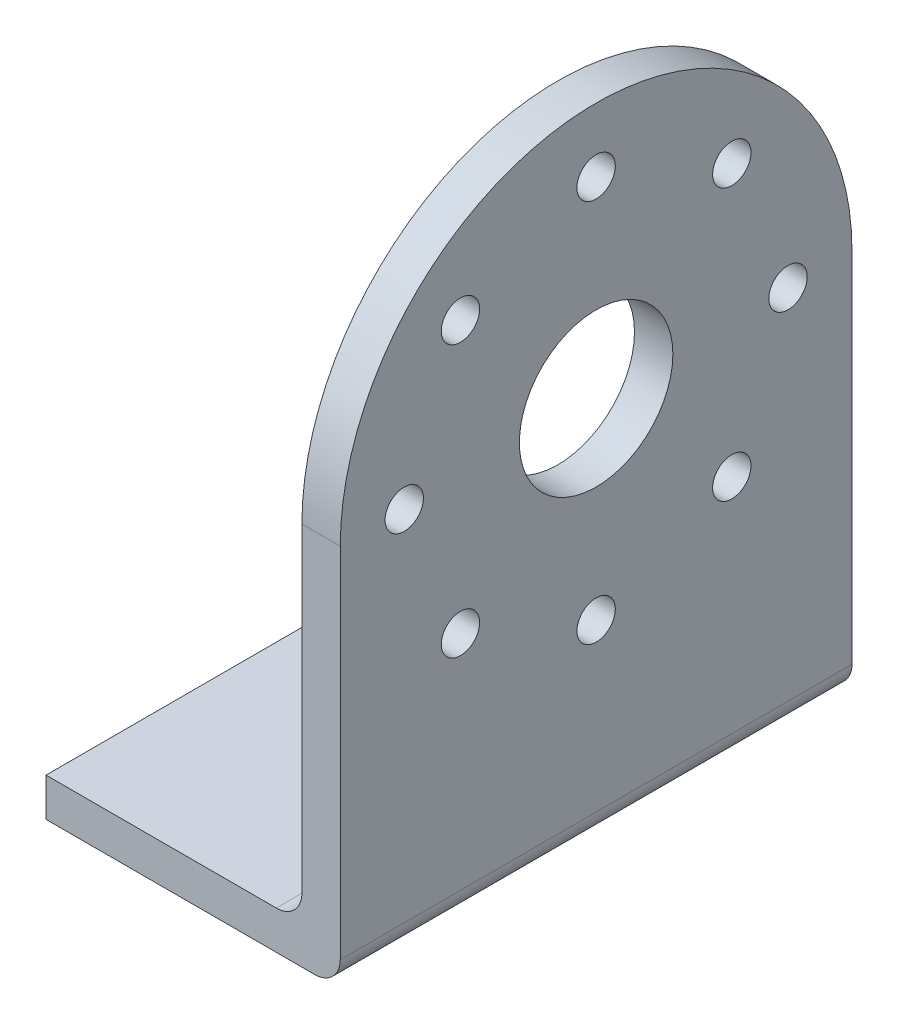
ISO-10303-21;
HEADER;
FILE_DESCRIPTION(('STEP AP214'),'2;1');
FILE_NAME('part.step','',(''),(''),'','','');
FILE_SCHEMA(('AUTOMOTIVE_DESIGN { 1 0 10303 214 1 1 1 1 }'));
ENDSEC;
DATA;
#1=APPLICATION_CONTEXT('core data for automotive mechanical design processes');
#2=APPLICATION_PROTOCOL_DEFINITION('international standard','automotive_design',2000,#1);
#3=PRODUCT_CONTEXT('',#1,'mechanical');
#4=PRODUCT('Part','Part','',(#3));
#5=PRODUCT_RELATED_PRODUCT_CATEGORY('part','',(#4));
#6=PRODUCT_DEFINITION_FORMATION('','',#4);
#7=PRODUCT_DEFINITION_CONTEXT('part definition',#1,'design');
#8=PRODUCT_DEFINITION('design','',#6,#7);
#9=PRODUCT_DEFINITION_SHAPE('','',#8);
#10=(LENGTH_UNIT() NAMED_UNIT(*) SI_UNIT(.MILLI.,.METRE.));
#11=(NAMED_UNIT(*) PLANE_ANGLE_UNIT() SI_UNIT($,.RADIAN.));
#12=(NAMED_UNIT(*) SI_UNIT($,.STERADIAN.) SOLID_ANGLE_UNIT());
#13=UNCERTAINTY_MEASURE_WITH_UNIT(LENGTH_MEASURE(1.E-05),#10,'distance_accuracy_value','');
#14=(GEOMETRIC_REPRESENTATION_CONTEXT(3) GLOBAL_UNCERTAINTY_ASSIGNED_CONTEXT((#13)) GLOBAL_UNIT_ASSIGNED_CONTEXT((#10,
#11,#12)) REPRESENTATION_CONTEXT('',''));
#15=CARTESIAN_POINT('',(0.,0.,0.));
#16=DIRECTION('',(0.,0.,1.));
#17=DIRECTION('',(1.,0.,0.));
#18=AXIS2_PLACEMENT_3D('',#15,#16,#17);
#19=CARTESIAN_POINT('',(0.,0.,0.));
#20=DIRECTION('',(1.,0.,0.));
#21=DIRECTION('',(0.,0.,-1.));
#22=AXIS2_PLACEMENT_3D('',#19,#20,#21);
#23=PLANE('',#22);
#24=CARTESIAN_POINT('',(0.,0.,0.));
#25=DIRECTION('',(1.,0.,0.));
#26=DIRECTION('',(0.,0.,-1.));
#27=AXIS2_PLACEMENT_3D('',#24,#25,#26);
#28=CIRCLE('',#27,6.);
#29=CARTESIAN_POINT('',(0.,0.,-6.));
#30=VERTEX_POINT('',#29);
#31=EDGE_CURVE('E194',#30,#30,#28,.T.);
#32=ORIENTED_EDGE('',*,*,#31,.T.);
#33=EDGE_LOOP('',(#32));
#34=FACE_BOUND('',#33,.T.);
#35=CARTESIAN_POINT('',(0.,15.,0.));
#36=DIRECTION('',(1.,0.,0.));
#37=DIRECTION('',(0.,0.,-1.));
#38=AXIS2_PLACEMENT_3D('',#35,#36,#37);
#39=CIRCLE('',#38,1.5);
#40=CARTESIAN_POINT('',(0.,15.,-1.5));
#41=VERTEX_POINT('',#40);
#42=EDGE_CURVE('E191',#41,#41,#39,.T.);
#43=ORIENTED_EDGE('',*,*,#42,.T.);
#44=EDGE_LOOP('',(#43));
#45=FACE_BOUND('',#44,.T.);
#46=CARTESIAN_POINT('',(0.,10.6066017177982,-10.6066017177982));
#47=DIRECTION('',(1.,0.,0.));
#48=DIRECTION('',(0.,0.,-1.));
#49=AXIS2_PLACEMENT_3D('',#46,#47,#48);
#50=CIRCLE('',#49,1.5);
#51=CARTESIAN_POINT('',(0.,10.6066017177982,-12.1066017177982));
#52=VERTEX_POINT('',#51);
#53=EDGE_CURVE('E188',#52,#52,#50,.T.);
#54=ORIENTED_EDGE('',*,*,#53,.T.);
#55=EDGE_LOOP('',(#54));
#56=FACE_BOUND('',#55,.T.);
#57=CARTESIAN_POINT('',(0.,6.36733006886009E-13,-15.0000000000006));
#58=DIRECTION('',(1.,0.,0.));
#59=DIRECTION('',(0.,0.,-1.));
#60=AXIS2_PLACEMENT_3D('',#57,#58,#59);
#61=CIRCLE('',#60,1.5);
#62=CARTESIAN_POINT('',(0.,6.36733006886009E-13,-16.5000000000006));
#63=VERTEX_POINT('',#62);
#64=EDGE_CURVE('E185',#63,#63,#61,.T.);
#65=ORIENTED_EDGE('',*,*,#64,.T.);
#66=EDGE_LOOP('',(#65));
#67=FACE_BOUND('',#66,.T.);
#68=CARTESIAN_POINT('',(0.,-10.6066017177978,-10.6066017177993));
#69=DIRECTION('',(1.,0.,0.));
#70=DIRECTION('',(0.,0.,-1.));
#71=AXIS2_PLACEMENT_3D('',#68,#69,#70);
#72=CIRCLE('',#71,1.5);
#73=CARTESIAN_POINT('',(0.,-10.6066017177978,-12.1066017177993));
#74=VERTEX_POINT('',#73);
#75=EDGE_CURVE('E182',#74,#74,#72,.T.);
#76=ORIENTED_EDGE('',*,*,#75,.T.);
#77=EDGE_LOOP('',(#76));
#78=FACE_BOUND('',#77,.T.);
#79=CARTESIAN_POINT('',(0.,-15.,-1.27490493809038E-12));
#80=DIRECTION('',(1.,0.,0.));
#81=DIRECTION('',(0.,0.,-1.));
#82=AXIS2_PLACEMENT_3D('',#79,#80,#81);
#83=CIRCLE('',#82,1.5);
#84=CARTESIAN_POINT('',(0.,-15.,-1.50000000000127));
#85=VERTEX_POINT('',#84);
#86=EDGE_CURVE('E179',#85,#85,#83,.T.);
#87=ORIENTED_EDGE('',*,*,#86,.T.);
#88=EDGE_LOOP('',(#87));
#89=FACE_BOUND('',#88,.T.);
#90=CARTESIAN_POINT('',(0.,-10.6066017177987,10.6066017177971));
#91=DIRECTION('',(1.,0.,0.));
#92=DIRECTION('',(0.,0.,-1.));
#93=AXIS2_PLACEMENT_3D('',#90,#91,#92);
#94=CIRCLE('',#93,1.5);
#95=CARTESIAN_POINT('',(0.,-10.6066017177987,9.10660171779713));
#96=VERTEX_POINT('',#95);
#97=EDGE_CURVE('E176',#96,#96,#94,.T.);
#98=ORIENTED_EDGE('',*,*,#97,.T.);
#99=EDGE_LOOP('',(#98));
#100=FACE_BOUND('',#99,.T.);
#101=CARTESIAN_POINT('',(0.,-6.3856997708473E-13,14.9999999999994));
#102=DIRECTION('',(1.,0.,0.));
#103=DIRECTION('',(0.,0.,-1.));
#104=AXIS2_PLACEMENT_3D('',#101,#102,#103);
#105=CIRCLE('',#104,1.5);
#106=CARTESIAN_POINT('',(0.,-6.3856997708473E-13,13.4999999999994));
#107=VERTEX_POINT('',#106);
#108=EDGE_CURVE('E173',#107,#107,#105,.T.);
#109=ORIENTED_EDGE('',*,*,#108,.T.);
#110=EDGE_LOOP('',(#109));
#111=FACE_BOUND('',#110,.T.);
#112=CARTESIAN_POINT('',(0.,10.6066017177983,10.6066017177981));
#113=DIRECTION('',(1.,0.,0.));
#114=DIRECTION('',(0.,0.,-1.));
#115=AXIS2_PLACEMENT_3D('',#112,#113,#114);
#116=CIRCLE('',#115,1.5);
#117=CARTESIAN_POINT('',(0.,10.6066017177983,9.10660171779808));
#118=VERTEX_POINT('',#117);
#119=EDGE_CURVE('E136',#118,#118,#116,.T.);
#120=ORIENTED_EDGE('',*,*,#119,.T.);
#121=EDGE_LOOP('',(#120));
#122=FACE_BOUND('',#121,.T.);
#123=DIRECTION('',(0.,1.,0.));
#124=VECTOR('',#123,1.);
#125=CARTESIAN_POINT('',(0.,0.,-20.));
#126=LINE('',#125,#124);
#127=CARTESIAN_POINT('',(0.,-25.,-20.));
#128=VERTEX_POINT('',#127);
#129=CARTESIAN_POINT('',(0.,0.,-20.));
#130=VERTEX_POINT('',#129);
#131=EDGE_CURVE('E197',#128,#130,#126,.T.);
#132=ORIENTED_EDGE('',*,*,#131,.F.);
#133=DIRECTION('',(0.,0.,-1.));
#134=VECTOR('',#133,1.);
#135=CARTESIAN_POINT('',(0.,-25.,20.));
#136=LINE('',#135,#134);
#137=CARTESIAN_POINT('',(0.,-25.,20.));
#138=VERTEX_POINT('',#137);
#139=EDGE_CURVE('E61',#128,#138,#136,.F.);
#140=ORIENTED_EDGE('',*,*,#139,.T.);
#141=DIRECTION('',(0.,-1.,0.));
#142=VECTOR('',#141,1.);
#143=CARTESIAN_POINT('',(0.,0.,20.));
#144=LINE('',#143,#142);
#145=CARTESIAN_POINT('',(0.,0.,20.));
#146=VERTEX_POINT('',#145);
#147=EDGE_CURVE('E141',#146,#138,#144,.T.);
#148=ORIENTED_EDGE('',*,*,#147,.F.);
#149=CARTESIAN_POINT('',(0.,0.,0.));
#150=DIRECTION('',(1.,0.,0.));
#151=DIRECTION('',(0.,0.,-1.));
#152=AXIS2_PLACEMENT_3D('',#149,#150,#151);
#153=CIRCLE('',#152,20.);
#154=EDGE_CURVE('E199',#130,#146,#153,.T.);
#155=ORIENTED_EDGE('',*,*,#154,.F.);
#156=EDGE_LOOP('',(#132,#140,#148,#155));
#157=FACE_BOUND('',#156,.T.);
#158=ADVANCED_FACE('F40',(#34,#45,#56,#67,#78,#89,#100,#111,#122,#157),#23,.F.);
#159=CARTESIAN_POINT('',(3.,0.,-20.));
#160=DIRECTION('',(0.,0.,1.));
#161=DIRECTION('',(1.,0.,0.));
#162=AXIS2_PLACEMENT_3D('',#159,#160,#161);
#163=PLANE('',#162);
#164=DIRECTION('',(0.,1.,0.));
#165=VECTOR('',#164,1.);
#166=CARTESIAN_POINT('',(3.,0.,-20.));
#167=LINE('',#166,#165);
#168=CARTESIAN_POINT('',(3.,-28.,-20.));
#169=VERTEX_POINT('',#168);
#170=CARTESIAN_POINT('',(3.,0.,-20.));
#171=VERTEX_POINT('',#170);
#172=EDGE_CURVE('E165',#169,#171,#167,.T.);
#173=ORIENTED_EDGE('',*,*,#172,.F.);
#174=CARTESIAN_POINT('',(1.,-28.,-20.));
#175=DIRECTION('',(0.,0.,1.));
#176=DIRECTION('',(1.,0.,0.));
#177=AXIS2_PLACEMENT_3D('',#174,#175,#176);
#178=CIRCLE('',#177,2.);
#179=CARTESIAN_POINT('',(1.,-30.,-20.));
#180=VERTEX_POINT('',#179);
#181=EDGE_CURVE('E109',#169,#180,#178,.F.);
#182=ORIENTED_EDGE('',*,*,#181,.T.);
#183=DIRECTION('',(-1.,0.,0.));
#184=VECTOR('',#183,1.);
#185=CARTESIAN_POINT('',(3.,-30.,-20.));
#186=LINE('',#185,#184);
#187=CARTESIAN_POINT('',(-20.,-30.,-20.));
#188=VERTEX_POINT('',#187);
#189=EDGE_CURVE('E103',#180,#188,#186,.T.);
#190=ORIENTED_EDGE('',*,*,#189,.T.);
#191=DIRECTION('',(0.,-1.,0.));
#192=VECTOR('',#191,1.);
#193=CARTESIAN_POINT('',(-20.,-27.,-20.));
#194=LINE('',#193,#192);
#195=CARTESIAN_POINT('',(-20.,-27.,-20.));
#196=VERTEX_POINT('',#195);
#197=EDGE_CURVE('E108',#196,#188,#194,.T.);
#198=ORIENTED_EDGE('',*,*,#197,.F.);
#199=DIRECTION('',(1.,0.,0.));
#200=VECTOR('',#199,1.);
#201=CARTESIAN_POINT('',(-20.,-27.,-20.));
#202=LINE('',#201,#200);
#203=CARTESIAN_POINT('',(-2.,-27.,-20.));
#204=VERTEX_POINT('',#203);
#205=EDGE_CURVE('E131',#196,#204,#202,.T.);
#206=ORIENTED_EDGE('',*,*,#205,.T.);
#207=CARTESIAN_POINT('',(-2.,-25.,-20.));
#208=DIRECTION('',(0.,0.,1.));
#209=DIRECTION('',(1.,0.,0.));
#210=AXIS2_PLACEMENT_3D('',#207,#208,#209);
#211=CIRCLE('',#210,2.);
#212=EDGE_CURVE('E48',#204,#128,#211,.T.);
#213=ORIENTED_EDGE('',*,*,#212,.T.);
#214=ORIENTED_EDGE('',*,*,#131,.T.);
#215=DIRECTION('',(-1.,0.,0.));
#216=VECTOR('',#215,1.);
#217=CARTESIAN_POINT('',(3.,0.,-20.));
#218=LINE('',#217,#216);
#219=EDGE_CURVE('E206',#171,#130,#218,.T.);
#220=ORIENTED_EDGE('',*,*,#219,.F.);
#221=EDGE_LOOP('',(#173,#182,#190,#198,#206,#213,#214,#220));
#222=FACE_BOUND('',#221,.T.);
#223=ADVANCED_FACE('F106',(#222),#163,.F.);
#224=CARTESIAN_POINT('',(3.,0.,0.));
#225=DIRECTION('',(-1.,0.,0.));
#226=DIRECTION('',(0.,0.,1.));
#227=AXIS2_PLACEMENT_3D('',#224,#225,#226);
#228=CYLINDRICAL_SURFACE('',#227,20.);
#229=ORIENTED_EDGE('',*,*,#154,.T.);
#230=DIRECTION('',(-1.,0.,0.));
#231=VECTOR('',#230,1.);
#232=CARTESIAN_POINT('',(3.,0.,20.));
#233=LINE('',#232,#231);
#234=CARTESIAN_POINT('',(3.,0.,20.));
#235=VERTEX_POINT('',#234);
#236=EDGE_CURVE('E203',#235,#146,#233,.T.);
#237=ORIENTED_EDGE('',*,*,#236,.F.);
#238=CARTESIAN_POINT('',(3.,0.,0.));
#239=DIRECTION('',(1.,0.,0.));
#240=DIRECTION('',(0.,0.,-1.));
#241=AXIS2_PLACEMENT_3D('',#238,#239,#240);
#242=CIRCLE('',#241,20.);
#243=EDGE_CURVE('E167',#171,#235,#242,.T.);
#244=ORIENTED_EDGE('',*,*,#243,.F.);
#245=ORIENTED_EDGE('',*,*,#219,.T.);
#246=EDGE_LOOP('',(#229,#237,#244,#245));
#247=FACE_BOUND('',#246,.T.);
#248=ADVANCED_FACE('F234',(#247),#228,.T.);
#249=CARTESIAN_POINT('',(3.,0.,20.));
#250=DIRECTION('',(0.,0.,-1.));
#251=DIRECTION('',(-1.,0.,0.));
#252=AXIS2_PLACEMENT_3D('',#249,#250,#251);
#253=PLANE('',#252);
#254=DIRECTION('',(-1.,0.,0.));
#255=VECTOR('',#254,1.);
#256=CARTESIAN_POINT('',(3.,-30.,20.));
#257=LINE('',#256,#255);
#258=CARTESIAN_POINT('',(1.,-30.,20.));
#259=VERTEX_POINT('',#258);
#260=CARTESIAN_POINT('',(-20.,-30.,20.));
#261=VERTEX_POINT('',#260);
#262=EDGE_CURVE('E112',#259,#261,#257,.T.);
#263=ORIENTED_EDGE('',*,*,#262,.F.);
#264=CARTESIAN_POINT('',(1.,-28.,20.));
#265=DIRECTION('',(0.,0.,-1.));
#266=DIRECTION('',(-1.,0.,0.));
#267=AXIS2_PLACEMENT_3D('',#264,#265,#266);
#268=CIRCLE('',#267,2.);
#269=CARTESIAN_POINT('',(3.,-28.,20.));
#270=VERTEX_POINT('',#269);
#271=EDGE_CURVE('E215',#259,#270,#268,.F.);
#272=ORIENTED_EDGE('',*,*,#271,.T.);
#273=DIRECTION('',(0.,-1.,0.));
#274=VECTOR('',#273,1.);
#275=CARTESIAN_POINT('',(3.,0.,20.));
#276=LINE('',#275,#274);
#277=EDGE_CURVE('E113',#235,#270,#276,.T.);
#278=ORIENTED_EDGE('',*,*,#277,.F.);
#279=ORIENTED_EDGE('',*,*,#236,.T.);
#280=ORIENTED_EDGE('',*,*,#147,.T.);
#281=CARTESIAN_POINT('',(-2.,-25.,20.));
#282=DIRECTION('',(0.,0.,-1.));
#283=DIRECTION('',(-1.,0.,0.));
#284=AXIS2_PLACEMENT_3D('',#281,#282,#283);
#285=CIRCLE('',#284,2.);
#286=CARTESIAN_POINT('',(-2.,-27.,20.));
#287=VERTEX_POINT('',#286);
#288=EDGE_CURVE('E11',#138,#287,#285,.T.);
#289=ORIENTED_EDGE('',*,*,#288,.T.);
#290=DIRECTION('',(1.,0.,0.));
#291=VECTOR('',#290,1.);
#292=CARTESIAN_POINT('',(-20.,-27.,20.));
#293=LINE('',#292,#291);
#294=CARTESIAN_POINT('',(-20.,-27.,20.));
#295=VERTEX_POINT('',#294);
#296=EDGE_CURVE('E133',#295,#287,#293,.T.);
#297=ORIENTED_EDGE('',*,*,#296,.F.);
#298=DIRECTION('',(0.,1.,0.));
#299=VECTOR('',#298,1.);
#300=CARTESIAN_POINT('',(-20.,-27.,20.));
#301=LINE('',#300,#299);
#302=EDGE_CURVE('E121',#261,#295,#301,.T.);
#303=ORIENTED_EDGE('',*,*,#302,.F.);
#304=EDGE_LOOP('',(#263,#272,#278,#279,#280,#289,#297,#303));
#305=FACE_BOUND('',#304,.T.);
#306=ADVANCED_FACE('F227',(#305),#253,.F.);
#307=CARTESIAN_POINT('',(3.,0.,0.));
#308=DIRECTION('',(-1.,0.,0.));
#309=DIRECTION('',(0.,0.,1.));
#310=AXIS2_PLACEMENT_3D('',#307,#308,#309);
#311=CYLINDRICAL_SURFACE('',#310,6.);
#312=CARTESIAN_POINT('',(3.,0.,0.));
#313=DIRECTION('',(1.,0.,0.));
#314=DIRECTION('',(0.,0.,-1.));
#315=AXIS2_PLACEMENT_3D('',#312,#313,#314);
#316=CIRCLE('',#315,6.);
#317=CARTESIAN_POINT('',(3.,0.,-6.));
#318=VERTEX_POINT('',#317);
#319=EDGE_CURVE('E162',#318,#318,#316,.T.);
#320=ORIENTED_EDGE('',*,*,#319,.T.);
#321=EDGE_LOOP('',(#320));
#322=FACE_BOUND('',#321,.T.);
#323=ORIENTED_EDGE('',*,*,#31,.F.);
#324=EDGE_LOOP('',(#323));
#325=FACE_BOUND('',#324,.T.);
#326=ADVANCED_FACE('F264',(#322,#325),#311,.F.);
#327=CARTESIAN_POINT('',(3.,15.,0.));
#328=DIRECTION('',(-1.,0.,0.));
#329=DIRECTION('',(0.,0.,1.));
#330=AXIS2_PLACEMENT_3D('',#327,#328,#329);
#331=CYLINDRICAL_SURFACE('',#330,1.5);
#332=CARTESIAN_POINT('',(3.,15.,0.));
#333=DIRECTION('',(1.,0.,0.));
#334=DIRECTION('',(0.,0.,-1.));
#335=AXIS2_PLACEMENT_3D('',#332,#333,#334);
#336=CIRCLE('',#335,1.5);
#337=CARTESIAN_POINT('',(3.,15.,-1.5));
#338=VERTEX_POINT('',#337);
#339=EDGE_CURVE('E159',#338,#338,#336,.T.);
#340=ORIENTED_EDGE('',*,*,#339,.T.);
#341=EDGE_LOOP('',(#340));
#342=FACE_BOUND('',#341,.T.);
#343=ORIENTED_EDGE('',*,*,#42,.F.);
#344=EDGE_LOOP('',(#343));
#345=FACE_BOUND('',#344,.T.);
#346=ADVANCED_FACE('F269',(#342,#345),#331,.F.);
#347=CARTESIAN_POINT('',(3.,10.6066017177982,-10.6066017177982));
#348=DIRECTION('',(-1.,0.,0.));
#349=DIRECTION('',(0.,0.,1.));
#350=AXIS2_PLACEMENT_3D('',#347,#348,#349);
#351=CYLINDRICAL_SURFACE('',#350,1.5);
#352=CARTESIAN_POINT('',(3.,10.6066017177982,-10.6066017177982));
#353=DIRECTION('',(1.,0.,0.));
#354=DIRECTION('',(0.,0.,-1.));
#355=AXIS2_PLACEMENT_3D('',#352,#353,#354);
#356=CIRCLE('',#355,1.5);
#357=CARTESIAN_POINT('',(3.,10.6066017177982,-12.1066017177982));
#358=VERTEX_POINT('',#357);
#359=EDGE_CURVE('E156',#358,#358,#356,.T.);
#360=ORIENTED_EDGE('',*,*,#359,.T.);
#361=EDGE_LOOP('',(#360));
#362=FACE_BOUND('',#361,.T.);
#363=ORIENTED_EDGE('',*,*,#53,.F.);
#364=EDGE_LOOP('',(#363));
#365=FACE_BOUND('',#364,.T.);
#366=ADVANCED_FACE('F273',(#362,#365),#351,.F.);
#367=CARTESIAN_POINT('',(3.,6.36733006886009E-13,-15.0000000000006));
#368=DIRECTION('',(-1.,0.,0.));
#369=DIRECTION('',(0.,0.,1.));
#370=AXIS2_PLACEMENT_3D('',#367,#368,#369);
#371=CYLINDRICAL_SURFACE('',#370,1.5);
#372=CARTESIAN_POINT('',(3.,6.36733006886009E-13,-15.0000000000006));
#373=DIRECTION('',(1.,0.,0.));
#374=DIRECTION('',(0.,0.,-1.));
#375=AXIS2_PLACEMENT_3D('',#372,#373,#374);
#376=CIRCLE('',#375,1.5);
#377=CARTESIAN_POINT('',(3.,6.36733006886009E-13,-16.5000000000006));
#378=VERTEX_POINT('',#377);
#379=EDGE_CURVE('E153',#378,#378,#376,.T.);
#380=ORIENTED_EDGE('',*,*,#379,.T.);
#381=EDGE_LOOP('',(#380));
#382=FACE_BOUND('',#381,.T.);
#383=ORIENTED_EDGE('',*,*,#64,.F.);
#384=EDGE_LOOP('',(#383));
#385=FACE_BOUND('',#384,.T.);
#386=ADVANCED_FACE('F277',(#382,#385),#371,.F.);
#387=CARTESIAN_POINT('',(3.,-10.6066017177978,-10.6066017177993));
#388=DIRECTION('',(-1.,0.,0.));
#389=DIRECTION('',(0.,0.,1.));
#390=AXIS2_PLACEMENT_3D('',#387,#388,#389);
#391=CYLINDRICAL_SURFACE('',#390,1.5);
#392=CARTESIAN_POINT('',(3.,-10.6066017177978,-10.6066017177993));
#393=DIRECTION('',(1.,0.,0.));
#394=DIRECTION('',(0.,0.,-1.));
#395=AXIS2_PLACEMENT_3D('',#392,#393,#394);
#396=CIRCLE('',#395,1.5);
#397=CARTESIAN_POINT('',(3.,-10.6066017177978,-12.1066017177993));
#398=VERTEX_POINT('',#397);
#399=EDGE_CURVE('E150',#398,#398,#396,.T.);
#400=ORIENTED_EDGE('',*,*,#399,.T.);
#401=EDGE_LOOP('',(#400));
#402=FACE_BOUND('',#401,.T.);
#403=ORIENTED_EDGE('',*,*,#75,.F.);
#404=EDGE_LOOP('',(#403));
#405=FACE_BOUND('',#404,.T.);
#406=ADVANCED_FACE('F281',(#402,#405),#391,.F.);
#407=CARTESIAN_POINT('',(3.,-15.,-1.27490493809038E-12));
#408=DIRECTION('',(-1.,0.,0.));
#409=DIRECTION('',(0.,0.,1.));
#410=AXIS2_PLACEMENT_3D('',#407,#408,#409);
#411=CYLINDRICAL_SURFACE('',#410,1.5);
#412=CARTESIAN_POINT('',(3.,-15.,-1.27490493809038E-12));
#413=DIRECTION('',(1.,0.,0.));
#414=DIRECTION('',(0.,0.,-1.));
#415=AXIS2_PLACEMENT_3D('',#412,#413,#414);
#416=CIRCLE('',#415,1.5);
#417=CARTESIAN_POINT('',(3.,-15.,-1.50000000000127));
#418=VERTEX_POINT('',#417);
#419=EDGE_CURVE('E147',#418,#418,#416,.T.);
#420=ORIENTED_EDGE('',*,*,#419,.T.);
#421=EDGE_LOOP('',(#420));
#422=FACE_BOUND('',#421,.T.);
#423=ORIENTED_EDGE('',*,*,#86,.F.);
#424=EDGE_LOOP('',(#423));
#425=FACE_BOUND('',#424,.T.);
#426=ADVANCED_FACE('F285',(#422,#425),#411,.F.);
#427=CARTESIAN_POINT('',(3.,-10.6066017177987,10.6066017177971));
#428=DIRECTION('',(-1.,0.,0.));
#429=DIRECTION('',(0.,0.,1.));
#430=AXIS2_PLACEMENT_3D('',#427,#428,#429);
#431=CYLINDRICAL_SURFACE('',#430,1.5);
#432=CARTESIAN_POINT('',(3.,-10.6066017177987,10.6066017177971));
#433=DIRECTION('',(1.,0.,0.));
#434=DIRECTION('',(0.,0.,-1.));
#435=AXIS2_PLACEMENT_3D('',#432,#433,#434);
#436=CIRCLE('',#435,1.5);
#437=CARTESIAN_POINT('',(3.,-10.6066017177987,9.10660171779713));
#438=VERTEX_POINT('',#437);
#439=EDGE_CURVE('E144',#438,#438,#436,.T.);
#440=ORIENTED_EDGE('',*,*,#439,.T.);
#441=EDGE_LOOP('',(#440));
#442=FACE_BOUND('',#441,.T.);
#443=ORIENTED_EDGE('',*,*,#97,.F.);
#444=EDGE_LOOP('',(#443));
#445=FACE_BOUND('',#444,.T.);
#446=ADVANCED_FACE('F289',(#442,#445),#431,.F.);
#447=CARTESIAN_POINT('',(3.,-6.3856997708473E-13,14.9999999999994));
#448=DIRECTION('',(-1.,0.,0.));
#449=DIRECTION('',(0.,0.,1.));
#450=AXIS2_PLACEMENT_3D('',#447,#448,#449);
#451=CYLINDRICAL_SURFACE('',#450,1.5);
#452=CARTESIAN_POINT('',(3.,-6.3856997708473E-13,14.9999999999994));
#453=DIRECTION('',(1.,0.,0.));
#454=DIRECTION('',(0.,0.,-1.));
#455=AXIS2_PLACEMENT_3D('',#452,#453,#454);
#456=CIRCLE('',#455,1.5);
#457=CARTESIAN_POINT('',(3.,-6.3856997708473E-13,13.4999999999994));
#458=VERTEX_POINT('',#457);
#459=EDGE_CURVE('E140',#458,#458,#456,.T.);
#460=ORIENTED_EDGE('',*,*,#459,.T.);
#461=EDGE_LOOP('',(#460));
#462=FACE_BOUND('',#461,.T.);
#463=ORIENTED_EDGE('',*,*,#108,.F.);
#464=EDGE_LOOP('',(#463));
#465=FACE_BOUND('',#464,.T.);
#466=ADVANCED_FACE('F293',(#462,#465),#451,.F.);
#467=CARTESIAN_POINT('',(3.,10.6066017177983,10.6066017177981));
#468=DIRECTION('',(-1.,0.,0.));
#469=DIRECTION('',(0.,0.,1.));
#470=AXIS2_PLACEMENT_3D('',#467,#468,#469);
#471=CYLINDRICAL_SURFACE('',#470,1.5);
#472=CARTESIAN_POINT('',(3.,10.6066017177983,10.6066017177981));
#473=DIRECTION('',(1.,0.,0.));
#474=DIRECTION('',(0.,0.,-1.));
#475=AXIS2_PLACEMENT_3D('',#472,#473,#474);
#476=CIRCLE('',#475,1.5);
#477=CARTESIAN_POINT('',(3.,10.6066017177983,9.10660171779808));
#478=VERTEX_POINT('',#477);
#479=EDGE_CURVE('E137',#478,#478,#476,.T.);
#480=ORIENTED_EDGE('',*,*,#479,.T.);
#481=EDGE_LOOP('',(#480));
#482=FACE_BOUND('',#481,.T.);
#483=ORIENTED_EDGE('',*,*,#119,.F.);
#484=EDGE_LOOP('',(#483));
#485=FACE_BOUND('',#484,.T.);
#486=ADVANCED_FACE('F261',(#482,#485),#471,.F.);
#487=CARTESIAN_POINT('',(3.,-30.,0.));
#488=DIRECTION('',(0.,1.,0.));
#489=DIRECTION('',(0.,0.,1.));
#490=AXIS2_PLACEMENT_3D('',#487,#488,#489);
#491=PLANE('',#490);
#492=ORIENTED_EDGE('',*,*,#189,.F.);
#493=DIRECTION('',(0.,0.,-1.));
#494=VECTOR('',#493,1.);
#495=CARTESIAN_POINT('',(1.,-30.,20.));
#496=LINE('',#495,#494);
#497=EDGE_CURVE('E213',#180,#259,#496,.F.);
#498=ORIENTED_EDGE('',*,*,#497,.T.);
#499=ORIENTED_EDGE('',*,*,#262,.T.);
#500=DIRECTION('',(0.,0.,1.));
#501=VECTOR('',#500,1.);
#502=CARTESIAN_POINT('',(-20.,-30.,-20.));
#503=LINE('',#502,#501);
#504=EDGE_CURVE('E116',#188,#261,#503,.T.);
#505=ORIENTED_EDGE('',*,*,#504,.F.);
#506=EDGE_LOOP('',(#492,#498,#499,#505));
#507=FACE_BOUND('',#506,.T.);
#508=ADVANCED_FACE('F117',(#507),#491,.F.);
#509=CARTESIAN_POINT('',(3.,0.,0.));
#510=DIRECTION('',(1.,0.,0.));
#511=DIRECTION('',(0.,0.,-1.));
#512=AXIS2_PLACEMENT_3D('',#509,#510,#511);
#513=PLANE('',#512);
#514=ORIENTED_EDGE('',*,*,#479,.F.);
#515=EDGE_LOOP('',(#514));
#516=FACE_BOUND('',#515,.T.);
#517=ORIENTED_EDGE('',*,*,#459,.F.);
#518=EDGE_LOOP('',(#517));
#519=FACE_BOUND('',#518,.T.);
#520=ORIENTED_EDGE('',*,*,#439,.F.);
#521=EDGE_LOOP('',(#520));
#522=FACE_BOUND('',#521,.T.);
#523=ORIENTED_EDGE('',*,*,#419,.F.);
#524=EDGE_LOOP('',(#523));
#525=FACE_BOUND('',#524,.T.);
#526=ORIENTED_EDGE('',*,*,#399,.F.);
#527=EDGE_LOOP('',(#526));
#528=FACE_BOUND('',#527,.T.);
#529=ORIENTED_EDGE('',*,*,#379,.F.);
#530=EDGE_LOOP('',(#529));
#531=FACE_BOUND('',#530,.T.);
#532=ORIENTED_EDGE('',*,*,#359,.F.);
#533=EDGE_LOOP('',(#532));
#534=FACE_BOUND('',#533,.T.);
#535=ORIENTED_EDGE('',*,*,#339,.F.);
#536=EDGE_LOOP('',(#535));
#537=FACE_BOUND('',#536,.T.);
#538=ORIENTED_EDGE('',*,*,#319,.F.);
#539=EDGE_LOOP('',(#538));
#540=FACE_BOUND('',#539,.T.);
#541=ORIENTED_EDGE('',*,*,#277,.T.);
#542=DIRECTION('',(0.,0.,-1.));
#543=VECTOR('',#542,1.);
#544=CARTESIAN_POINT('',(3.,-28.,-20.));
#545=LINE('',#544,#543);
#546=EDGE_CURVE('E209',#270,#169,#545,.T.);
#547=ORIENTED_EDGE('',*,*,#546,.T.);
#548=ORIENTED_EDGE('',*,*,#172,.T.);
#549=ORIENTED_EDGE('',*,*,#243,.T.);
#550=EDGE_LOOP('',(#541,#547,#548,#549));
#551=FACE_BOUND('',#550,.T.);
#552=ADVANCED_FACE('F236',(#516,#519,#522,#525,#528,#531,#534,#537,#540,#551),#513,.T.);
#553=CARTESIAN_POINT('',(-20.,-27.,-20.));
#554=DIRECTION('',(0.,-1.,0.));
#555=DIRECTION('',(0.,0.,-1.));
#556=AXIS2_PLACEMENT_3D('',#553,#554,#555);
#557=PLANE('',#556);
#558=ORIENTED_EDGE('',*,*,#296,.T.);
#559=DIRECTION('',(0.,0.,-1.));
#560=VECTOR('',#559,1.);
#561=CARTESIAN_POINT('',(-2.,-27.,-20.));
#562=LINE('',#561,#560);
#563=EDGE_CURVE('E217',#287,#204,#562,.T.);
#564=ORIENTED_EDGE('',*,*,#563,.T.);
#565=ORIENTED_EDGE('',*,*,#205,.F.);
#566=DIRECTION('',(0.,0.,-1.));
#567=VECTOR('',#566,1.);
#568=CARTESIAN_POINT('',(-20.,-27.,-20.));
#569=LINE('',#568,#567);
#570=EDGE_CURVE('E125',#295,#196,#569,.T.);
#571=ORIENTED_EDGE('',*,*,#570,.F.);
#572=EDGE_LOOP('',(#558,#564,#565,#571));
#573=FACE_BOUND('',#572,.T.);
#574=ADVANCED_FACE('F222',(#573),#557,.F.);
#575=CARTESIAN_POINT('',(-20.,0.,0.));
#576=DIRECTION('',(-1.,0.,0.));
#577=DIRECTION('',(0.,0.,1.));
#578=AXIS2_PLACEMENT_3D('',#575,#576,#577);
#579=PLANE('',#578);
#580=ORIENTED_EDGE('',*,*,#197,.T.);
#581=ORIENTED_EDGE('',*,*,#504,.T.);
#582=ORIENTED_EDGE('',*,*,#302,.T.);
#583=ORIENTED_EDGE('',*,*,#570,.T.);
#584=EDGE_LOOP('',(#580,#581,#582,#583));
#585=FACE_BOUND('',#584,.T.);
#586=ADVANCED_FACE('F123',(#585),#579,.T.);
#587=CARTESIAN_POINT('',(1.,-28.,0.));
#588=DIRECTION('',(0.,0.,1.));
#589=DIRECTION('',(1.,0.,0.));
#590=AXIS2_PLACEMENT_3D('',#587,#588,#589);
#591=CYLINDRICAL_SURFACE('',#590,2.);
#592=ORIENTED_EDGE('',*,*,#271,.F.);
#593=ORIENTED_EDGE('',*,*,#497,.F.);
#594=ORIENTED_EDGE('',*,*,#181,.F.);
#595=ORIENTED_EDGE('',*,*,#546,.F.);
#596=EDGE_LOOP('',(#592,#593,#594,#595));
#597=FACE_BOUND('',#596,.T.);
#598=ADVANCED_FACE('F240',(#597),#591,.T.);
#599=CARTESIAN_POINT('',(-2.,-25.,-20.));
#600=DIRECTION('',(0.,0.,1.));
#601=DIRECTION('',(1.,0.,0.));
#602=AXIS2_PLACEMENT_3D('',#599,#600,#601);
#603=CYLINDRICAL_SURFACE('',#602,2.);
#604=ORIENTED_EDGE('',*,*,#288,.F.);
#605=ORIENTED_EDGE('',*,*,#139,.F.);
#606=ORIENTED_EDGE('',*,*,#212,.F.);
#607=ORIENTED_EDGE('',*,*,#563,.F.);
#608=EDGE_LOOP('',(#604,#605,#606,#607));
#609=FACE_BOUND('',#608,.T.);
#610=ADVANCED_FACE('F42',(#609),#603,.F.);
#611=CLOSED_SHELL('',(#158,#223,#248,#306,#326,#346,#366,#386,#406,#426,#446,#466,#486,#508,
#552,#574,#586,#598,#610));
#612=MANIFOLD_SOLID_BREP('B2',#611);
#613=ADVANCED_BREP_SHAPE_REPRESENTATION('',(#18,#612),#14);
#614=SHAPE_DEFINITION_REPRESENTATION(#9,#613);
ENDSEC;
END-ISO-10303-21;
